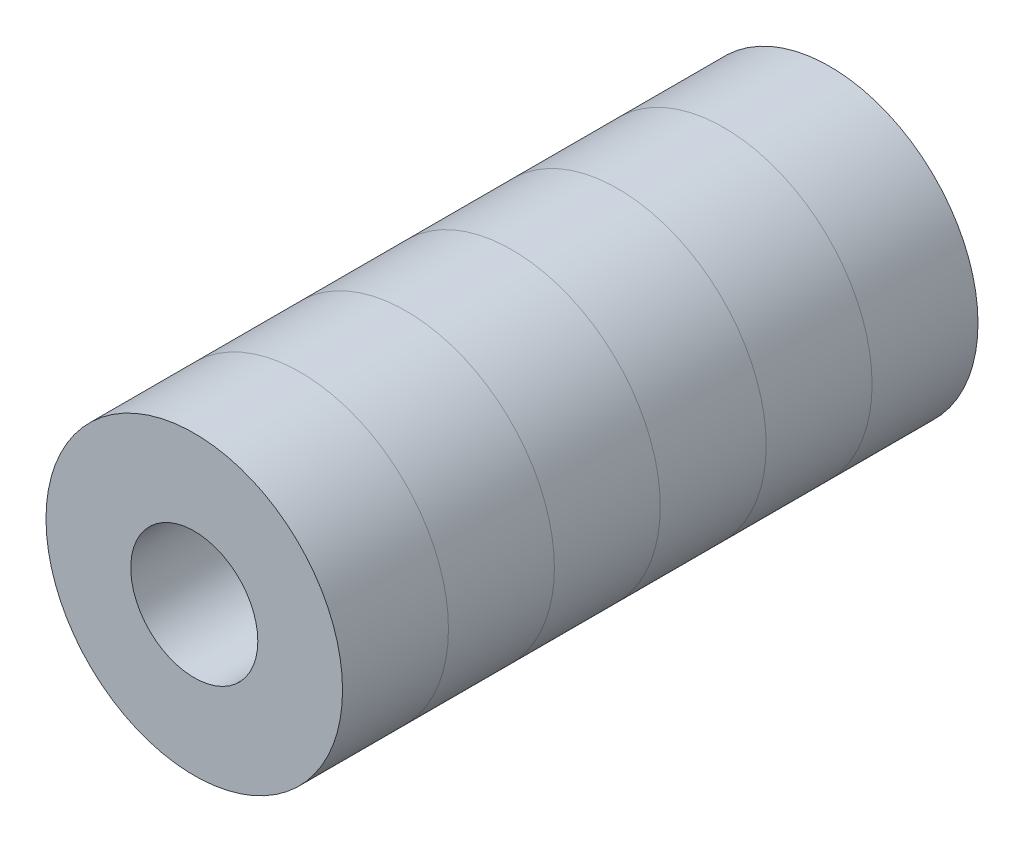
ISO-10303-21;
HEADER;
FILE_DESCRIPTION(('STEP AP214'),'2;1');
FILE_NAME('part.step','',(''),(''),'','','');
FILE_SCHEMA(('AUTOMOTIVE_DESIGN { 1 0 10303 214 1 1 1 1 }'));
ENDSEC;
DATA;
#1=APPLICATION_CONTEXT('core data for automotive mechanical design processes');
#2=APPLICATION_PROTOCOL_DEFINITION('international standard','automotive_design',2000,#1);
#3=PRODUCT_CONTEXT('',#1,'mechanical');
#4=PRODUCT('Part','Part','',(#3));
#5=PRODUCT_RELATED_PRODUCT_CATEGORY('part','',(#4));
#6=PRODUCT_DEFINITION_FORMATION('','',#4);
#7=PRODUCT_DEFINITION_CONTEXT('part definition',#1,'design');
#8=PRODUCT_DEFINITION('design','',#6,#7);
#9=PRODUCT_DEFINITION_SHAPE('','',#8);
#10=(LENGTH_UNIT() NAMED_UNIT(*) SI_UNIT(.MILLI.,.METRE.));
#11=(NAMED_UNIT(*) PLANE_ANGLE_UNIT() SI_UNIT($,.RADIAN.));
#12=(NAMED_UNIT(*) SI_UNIT($,.STERADIAN.) SOLID_ANGLE_UNIT());
#13=UNCERTAINTY_MEASURE_WITH_UNIT(LENGTH_MEASURE(1.E-05),#10,'distance_accuracy_value','');
#14=(GEOMETRIC_REPRESENTATION_CONTEXT(3) GLOBAL_UNCERTAINTY_ASSIGNED_CONTEXT((#13)) GLOBAL_UNIT_ASSIGNED_CONTEXT((#10,
#11,#12)) REPRESENTATION_CONTEXT('',''));
#15=CARTESIAN_POINT('',(0.,0.,0.));
#16=DIRECTION('',(0.,0.,1.));
#17=DIRECTION('',(1.,0.,0.));
#18=AXIS2_PLACEMENT_3D('',#15,#16,#17);
#19=CARTESIAN_POINT('',(0.,0.,-10.));
#20=DIRECTION('',(0.,0.,1.));
#21=DIRECTION('',(1.,0.,0.));
#22=AXIS2_PLACEMENT_3D('',#19,#20,#21);
#23=PLANE('',#22);
#24=CARTESIAN_POINT('',(0.,0.,-10.));
#25=DIRECTION('',(0.,0.,1.));
#26=DIRECTION('',(1.,0.,0.));
#27=AXIS2_PLACEMENT_3D('',#24,#25,#26);
#28=CIRCLE('',#27,3.5);
#29=CARTESIAN_POINT('',(3.5,0.,-10.));
#30=VERTEX_POINT('',#29);
#31=EDGE_CURVE('E11',#30,#30,#28,.T.);
#32=ORIENTED_EDGE('',*,*,#31,.T.);
#33=EDGE_LOOP('',(#32));
#34=FACE_BOUND('',#33,.T.);
#35=CARTESIAN_POINT('',(0.,0.,-10.));
#36=DIRECTION('',(0.,0.,1.));
#37=DIRECTION('',(1.,0.,0.));
#38=AXIS2_PLACEMENT_3D('',#35,#36,#37);
#39=CIRCLE('',#38,1.5);
#40=CARTESIAN_POINT('',(1.5,0.,-10.));
#41=VERTEX_POINT('',#40);
#42=EDGE_CURVE('E61',#41,#41,#39,.T.);
#43=ORIENTED_EDGE('',*,*,#42,.F.);
#44=EDGE_LOOP('',(#43));
#45=FACE_BOUND('',#44,.T.);
#46=ADVANCED_FACE('F50',(#34,#45),#23,.T.);
#47=CARTESIAN_POINT('',(0.,0.,-12.5));
#48=DIRECTION('',(0.,0.,1.));
#49=DIRECTION('',(1.,0.,0.));
#50=AXIS2_PLACEMENT_3D('',#47,#48,#49);
#51=PLANE('',#50);
#52=CARTESIAN_POINT('',(0.,0.,-12.5));
#53=DIRECTION('',(0.,0.,1.));
#54=DIRECTION('',(1.,0.,0.));
#55=AXIS2_PLACEMENT_3D('',#52,#53,#54);
#56=CIRCLE('',#55,3.5);
#57=CARTESIAN_POINT('',(3.5,0.,-12.5));
#58=VERTEX_POINT('',#57);
#59=EDGE_CURVE('E54',#58,#58,#56,.T.);
#60=ORIENTED_EDGE('',*,*,#59,.F.);
#61=EDGE_LOOP('',(#60));
#62=FACE_BOUND('',#61,.T.);
#63=CARTESIAN_POINT('',(0.,0.,-12.5));
#64=DIRECTION('',(0.,0.,1.));
#65=DIRECTION('',(1.,0.,0.));
#66=AXIS2_PLACEMENT_3D('',#63,#64,#65);
#67=CIRCLE('',#66,1.5);
#68=CARTESIAN_POINT('',(1.5,0.,-12.5));
#69=VERTEX_POINT('',#68);
#70=EDGE_CURVE('E63',#69,#69,#67,.T.);
#71=ORIENTED_EDGE('',*,*,#70,.T.);
#72=EDGE_LOOP('',(#71));
#73=FACE_BOUND('',#72,.T.);
#74=ADVANCED_FACE('F73',(#62,#73),#51,.F.);
#75=CARTESIAN_POINT('',(0.,0.,-10.));
#76=DIRECTION('',(0.,0.,-1.));
#77=DIRECTION('',(-1.,0.,0.));
#78=AXIS2_PLACEMENT_3D('',#75,#76,#77);
#79=CYLINDRICAL_SURFACE('',#78,3.5);
#80=ORIENTED_EDGE('',*,*,#31,.F.);
#81=EDGE_LOOP('',(#80));
#82=FACE_BOUND('',#81,.T.);
#83=ORIENTED_EDGE('',*,*,#59,.T.);
#84=EDGE_LOOP('',(#83));
#85=FACE_BOUND('',#84,.T.);
#86=ADVANCED_FACE('F52',(#82,#85),#79,.T.);
#87=CARTESIAN_POINT('',(0.,0.,-10.));
#88=DIRECTION('',(0.,0.,-1.));
#89=DIRECTION('',(-1.,0.,0.));
#90=AXIS2_PLACEMENT_3D('',#87,#88,#89);
#91=CYLINDRICAL_SURFACE('',#90,1.5);
#92=ORIENTED_EDGE('',*,*,#42,.T.);
#93=EDGE_LOOP('',(#92));
#94=FACE_BOUND('',#93,.T.);
#95=ORIENTED_EDGE('',*,*,#70,.F.);
#96=EDGE_LOOP('',(#95));
#97=FACE_BOUND('',#96,.T.);
#98=ADVANCED_FACE('F69',(#94,#97),#91,.F.);
#99=CLOSED_SHELL('',(#46,#74,#86,#98));
#100=MANIFOLD_SOLID_BREP('B2',#99);
#101=CARTESIAN_POINT('',(0.,0.,-7.5));
#102=DIRECTION('',(0.,0.,1.));
#103=DIRECTION('',(1.,0.,0.));
#104=AXIS2_PLACEMENT_3D('',#101,#102,#103);
#105=PLANE('',#104);
#106=CARTESIAN_POINT('',(0.,0.,-7.5));
#107=DIRECTION('',(0.,0.,1.));
#108=DIRECTION('',(1.,0.,0.));
#109=AXIS2_PLACEMENT_3D('',#106,#107,#108);
#110=CIRCLE('',#109,3.5);
#111=CARTESIAN_POINT('',(3.5,0.,-7.5));
#112=VERTEX_POINT('',#111);
#113=EDGE_CURVE('E49',#112,#112,#110,.T.);
#114=ORIENTED_EDGE('',*,*,#113,.T.);
#115=EDGE_LOOP('',(#114));
#116=FACE_BOUND('',#115,.T.);
#117=CARTESIAN_POINT('',(0.,0.,-7.5));
#118=DIRECTION('',(0.,0.,1.));
#119=DIRECTION('',(1.,0.,0.));
#120=AXIS2_PLACEMENT_3D('',#117,#118,#119);
#121=CIRCLE('',#120,1.5);
#122=CARTESIAN_POINT('',(1.5,0.,-7.5));
#123=VERTEX_POINT('',#122);
#124=EDGE_CURVE('E139',#123,#123,#121,.T.);
#125=ORIENTED_EDGE('',*,*,#124,.F.);
#126=EDGE_LOOP('',(#125));
#127=FACE_BOUND('',#126,.T.);
#128=ADVANCED_FACE('F128',(#116,#127),#105,.T.);
#129=CARTESIAN_POINT('',(0.,0.,-10.));
#130=DIRECTION('',(0.,0.,1.));
#131=DIRECTION('',(1.,0.,0.));
#132=AXIS2_PLACEMENT_3D('',#129,#130,#131);
#133=PLANE('',#132);
#134=CARTESIAN_POINT('',(0.,0.,-10.));
#135=DIRECTION('',(0.,0.,1.));
#136=DIRECTION('',(1.,0.,0.));
#137=AXIS2_PLACEMENT_3D('',#134,#135,#136);
#138=CIRCLE('',#137,3.5);
#139=CARTESIAN_POINT('',(3.5,0.,-10.));
#140=VERTEX_POINT('',#139);
#141=EDGE_CURVE('E132',#140,#140,#138,.T.);
#142=ORIENTED_EDGE('',*,*,#141,.F.);
#143=EDGE_LOOP('',(#142));
#144=FACE_BOUND('',#143,.T.);
#145=CARTESIAN_POINT('',(0.,0.,-10.));
#146=DIRECTION('',(0.,0.,1.));
#147=DIRECTION('',(1.,0.,0.));
#148=AXIS2_PLACEMENT_3D('',#145,#146,#147);
#149=CIRCLE('',#148,1.5);
#150=CARTESIAN_POINT('',(1.5,0.,-10.));
#151=VERTEX_POINT('',#150);
#152=EDGE_CURVE('E141',#151,#151,#149,.T.);
#153=ORIENTED_EDGE('',*,*,#152,.T.);
#154=EDGE_LOOP('',(#153));
#155=FACE_BOUND('',#154,.T.);
#156=ADVANCED_FACE('F151',(#144,#155),#133,.F.);
#157=CARTESIAN_POINT('',(0.,0.,-7.5));
#158=DIRECTION('',(0.,0.,-1.));
#159=DIRECTION('',(-1.,0.,0.));
#160=AXIS2_PLACEMENT_3D('',#157,#158,#159);
#161=CYLINDRICAL_SURFACE('',#160,3.5);
#162=ORIENTED_EDGE('',*,*,#113,.F.);
#163=EDGE_LOOP('',(#162));
#164=FACE_BOUND('',#163,.T.);
#165=ORIENTED_EDGE('',*,*,#141,.T.);
#166=EDGE_LOOP('',(#165));
#167=FACE_BOUND('',#166,.T.);
#168=ADVANCED_FACE('F130',(#164,#167),#161,.T.);
#169=CARTESIAN_POINT('',(0.,0.,-7.5));
#170=DIRECTION('',(0.,0.,-1.));
#171=DIRECTION('',(-1.,0.,0.));
#172=AXIS2_PLACEMENT_3D('',#169,#170,#171);
#173=CYLINDRICAL_SURFACE('',#172,1.5);
#174=ORIENTED_EDGE('',*,*,#124,.T.);
#175=EDGE_LOOP('',(#174));
#176=FACE_BOUND('',#175,.T.);
#177=ORIENTED_EDGE('',*,*,#152,.F.);
#178=EDGE_LOOP('',(#177));
#179=FACE_BOUND('',#178,.T.);
#180=ADVANCED_FACE('F147',(#176,#179),#173,.F.);
#181=CLOSED_SHELL('',(#128,#156,#168,#180));
#182=MANIFOLD_SOLID_BREP('B6',#181);
#183=CARTESIAN_POINT('',(0.,0.,-5.));
#184=DIRECTION('',(0.,0.,1.));
#185=DIRECTION('',(1.,0.,0.));
#186=AXIS2_PLACEMENT_3D('',#183,#184,#185);
#187=PLANE('',#186);
#188=CARTESIAN_POINT('',(0.,0.,-5.));
#189=DIRECTION('',(0.,0.,1.));
#190=DIRECTION('',(1.,0.,0.));
#191=AXIS2_PLACEMENT_3D('',#188,#189,#190);
#192=CIRCLE('',#191,3.5);
#193=CARTESIAN_POINT('',(3.5,0.,-5.));
#194=VERTEX_POINT('',#193);
#195=EDGE_CURVE('E127',#194,#194,#192,.T.);
#196=ORIENTED_EDGE('',*,*,#195,.T.);
#197=EDGE_LOOP('',(#196));
#198=FACE_BOUND('',#197,.T.);
#199=CARTESIAN_POINT('',(0.,0.,-5.));
#200=DIRECTION('',(0.,0.,1.));
#201=DIRECTION('',(1.,0.,0.));
#202=AXIS2_PLACEMENT_3D('',#199,#200,#201);
#203=CIRCLE('',#202,1.5);
#204=CARTESIAN_POINT('',(1.5,0.,-5.));
#205=VERTEX_POINT('',#204);
#206=EDGE_CURVE('E219',#205,#205,#203,.T.);
#207=ORIENTED_EDGE('',*,*,#206,.F.);
#208=EDGE_LOOP('',(#207));
#209=FACE_BOUND('',#208,.T.);
#210=ADVANCED_FACE('F206',(#198,#209),#187,.T.);
#211=CARTESIAN_POINT('',(0.,0.,-7.5));
#212=DIRECTION('',(0.,0.,1.));
#213=DIRECTION('',(1.,0.,0.));
#214=AXIS2_PLACEMENT_3D('',#211,#212,#213);
#215=PLANE('',#214);
#216=CARTESIAN_POINT('',(0.,0.,-7.5));
#217=DIRECTION('',(0.,0.,1.));
#218=DIRECTION('',(1.,0.,0.));
#219=AXIS2_PLACEMENT_3D('',#216,#217,#218);
#220=CIRCLE('',#219,3.5);
#221=CARTESIAN_POINT('',(3.5,0.,-7.5));
#222=VERTEX_POINT('',#221);
#223=EDGE_CURVE('E210',#222,#222,#220,.T.);
#224=ORIENTED_EDGE('',*,*,#223,.F.);
#225=EDGE_LOOP('',(#224));
#226=FACE_BOUND('',#225,.T.);
#227=CARTESIAN_POINT('',(0.,0.,-7.5));
#228=DIRECTION('',(0.,0.,1.));
#229=DIRECTION('',(1.,0.,0.));
#230=AXIS2_PLACEMENT_3D('',#227,#228,#229);
#231=CIRCLE('',#230,1.5);
#232=CARTESIAN_POINT('',(1.5,0.,-7.5));
#233=VERTEX_POINT('',#232);
#234=EDGE_CURVE('E221',#233,#233,#231,.T.);
#235=ORIENTED_EDGE('',*,*,#234,.T.);
#236=EDGE_LOOP('',(#235));
#237=FACE_BOUND('',#236,.T.);
#238=ADVANCED_FACE('F233',(#226,#237),#215,.F.);
#239=CARTESIAN_POINT('',(0.,0.,-5.));
#240=DIRECTION('',(0.,0.,-1.));
#241=DIRECTION('',(-1.,0.,0.));
#242=AXIS2_PLACEMENT_3D('',#239,#240,#241);
#243=CYLINDRICAL_SURFACE('',#242,3.5);
#244=ORIENTED_EDGE('',*,*,#195,.F.);
#245=EDGE_LOOP('',(#244));
#246=FACE_BOUND('',#245,.T.);
#247=ORIENTED_EDGE('',*,*,#223,.T.);
#248=EDGE_LOOP('',(#247));
#249=FACE_BOUND('',#248,.T.);
#250=ADVANCED_FACE('F208',(#246,#249),#243,.T.);
#251=CARTESIAN_POINT('',(0.,0.,-5.));
#252=DIRECTION('',(0.,0.,-1.));
#253=DIRECTION('',(-1.,0.,0.));
#254=AXIS2_PLACEMENT_3D('',#251,#252,#253);
#255=CYLINDRICAL_SURFACE('',#254,1.5);
#256=ORIENTED_EDGE('',*,*,#206,.T.);
#257=EDGE_LOOP('',(#256));
#258=FACE_BOUND('',#257,.T.);
#259=ORIENTED_EDGE('',*,*,#234,.F.);
#260=EDGE_LOOP('',(#259));
#261=FACE_BOUND('',#260,.T.);
#262=ADVANCED_FACE('F229',(#258,#261),#255,.F.);
#263=CLOSED_SHELL('',(#210,#238,#250,#262));
#264=MANIFOLD_SOLID_BREP('B44',#263);
#265=CARTESIAN_POINT('',(0.,0.,-2.5));
#266=DIRECTION('',(0.,0.,1.));
#267=DIRECTION('',(1.,0.,0.));
#268=AXIS2_PLACEMENT_3D('',#265,#266,#267);
#269=PLANE('',#268);
#270=CARTESIAN_POINT('',(0.,0.,-2.5));
#271=DIRECTION('',(0.,0.,1.));
#272=DIRECTION('',(1.,0.,0.));
#273=AXIS2_PLACEMENT_3D('',#270,#271,#272);
#274=CIRCLE('',#273,3.5);
#275=CARTESIAN_POINT('',(3.5,0.,-2.5));
#276=VERTEX_POINT('',#275);
#277=EDGE_CURVE('E205',#276,#276,#274,.T.);
#278=ORIENTED_EDGE('',*,*,#277,.T.);
#279=EDGE_LOOP('',(#278));
#280=FACE_BOUND('',#279,.T.);
#281=CARTESIAN_POINT('',(0.,0.,-2.5));
#282=DIRECTION('',(0.,0.,1.));
#283=DIRECTION('',(1.,0.,0.));
#284=AXIS2_PLACEMENT_3D('',#281,#282,#283);
#285=CIRCLE('',#284,1.5);
#286=CARTESIAN_POINT('',(1.5,0.,-2.5));
#287=VERTEX_POINT('',#286);
#288=EDGE_CURVE('E299',#287,#287,#285,.T.);
#289=ORIENTED_EDGE('',*,*,#288,.F.);
#290=EDGE_LOOP('',(#289));
#291=FACE_BOUND('',#290,.T.);
#292=ADVANCED_FACE('F288',(#280,#291),#269,.T.);
#293=CARTESIAN_POINT('',(0.,0.,-5.));
#294=DIRECTION('',(0.,0.,1.));
#295=DIRECTION('',(1.,0.,0.));
#296=AXIS2_PLACEMENT_3D('',#293,#294,#295);
#297=PLANE('',#296);
#298=CARTESIAN_POINT('',(0.,0.,-5.));
#299=DIRECTION('',(0.,0.,1.));
#300=DIRECTION('',(1.,0.,0.));
#301=AXIS2_PLACEMENT_3D('',#298,#299,#300);
#302=CIRCLE('',#301,3.5);
#303=CARTESIAN_POINT('',(3.5,0.,-5.));
#304=VERTEX_POINT('',#303);
#305=EDGE_CURVE('E292',#304,#304,#302,.T.);
#306=ORIENTED_EDGE('',*,*,#305,.F.);
#307=EDGE_LOOP('',(#306));
#308=FACE_BOUND('',#307,.T.);
#309=CARTESIAN_POINT('',(0.,0.,-5.));
#310=DIRECTION('',(0.,0.,1.));
#311=DIRECTION('',(1.,0.,0.));
#312=AXIS2_PLACEMENT_3D('',#309,#310,#311);
#313=CIRCLE('',#312,1.5);
#314=CARTESIAN_POINT('',(1.5,0.,-5.));
#315=VERTEX_POINT('',#314);
#316=EDGE_CURVE('E301',#315,#315,#313,.T.);
#317=ORIENTED_EDGE('',*,*,#316,.T.);
#318=EDGE_LOOP('',(#317));
#319=FACE_BOUND('',#318,.T.);
#320=ADVANCED_FACE('F311',(#308,#319),#297,.F.);
#321=CARTESIAN_POINT('',(0.,0.,-2.5));
#322=DIRECTION('',(0.,0.,-1.));
#323=DIRECTION('',(-1.,0.,0.));
#324=AXIS2_PLACEMENT_3D('',#321,#322,#323);
#325=CYLINDRICAL_SURFACE('',#324,3.5);
#326=ORIENTED_EDGE('',*,*,#277,.F.);
#327=EDGE_LOOP('',(#326));
#328=FACE_BOUND('',#327,.T.);
#329=ORIENTED_EDGE('',*,*,#305,.T.);
#330=EDGE_LOOP('',(#329));
#331=FACE_BOUND('',#330,.T.);
#332=ADVANCED_FACE('F290',(#328,#331),#325,.T.);
#333=CARTESIAN_POINT('',(0.,0.,-2.5));
#334=DIRECTION('',(0.,0.,-1.));
#335=DIRECTION('',(-1.,0.,0.));
#336=AXIS2_PLACEMENT_3D('',#333,#334,#335);
#337=CYLINDRICAL_SURFACE('',#336,1.5);
#338=ORIENTED_EDGE('',*,*,#288,.T.);
#339=EDGE_LOOP('',(#338));
#340=FACE_BOUND('',#339,.T.);
#341=ORIENTED_EDGE('',*,*,#316,.F.);
#342=EDGE_LOOP('',(#341));
#343=FACE_BOUND('',#342,.T.);
#344=ADVANCED_FACE('F307',(#340,#343),#337,.F.);
#345=CLOSED_SHELL('',(#292,#320,#332,#344));
#346=MANIFOLD_SOLID_BREP('B122',#345);
#347=CARTESIAN_POINT('',(0.,0.,0.));
#348=DIRECTION('',(0.,0.,1.));
#349=DIRECTION('',(1.,0.,0.));
#350=AXIS2_PLACEMENT_3D('',#347,#348,#349);
#351=PLANE('',#350);
#352=CARTESIAN_POINT('',(0.,0.,0.));
#353=DIRECTION('',(0.,0.,1.));
#354=DIRECTION('',(1.,0.,0.));
#355=AXIS2_PLACEMENT_3D('',#352,#353,#354);
#356=CIRCLE('',#355,3.5);
#357=CARTESIAN_POINT('',(3.5,0.,0.));
#358=VERTEX_POINT('',#357);
#359=EDGE_CURVE('E287',#358,#358,#356,.T.);
#360=ORIENTED_EDGE('',*,*,#359,.T.);
#361=EDGE_LOOP('',(#360));
#362=FACE_BOUND('',#361,.T.);
#363=CARTESIAN_POINT('',(0.,0.,0.));
#364=DIRECTION('',(0.,0.,1.));
#365=DIRECTION('',(1.,0.,0.));
#366=AXIS2_PLACEMENT_3D('',#363,#364,#365);
#367=CIRCLE('',#366,1.5);
#368=CARTESIAN_POINT('',(1.5,0.,0.));
#369=VERTEX_POINT('',#368);
#370=EDGE_CURVE('E376',#369,#369,#367,.T.);
#371=ORIENTED_EDGE('',*,*,#370,.F.);
#372=EDGE_LOOP('',(#371));
#373=FACE_BOUND('',#372,.T.);
#374=ADVANCED_FACE('F365',(#362,#373),#351,.T.);
#375=CARTESIAN_POINT('',(0.,0.,-2.5));
#376=DIRECTION('',(0.,0.,1.));
#377=DIRECTION('',(1.,0.,0.));
#378=AXIS2_PLACEMENT_3D('',#375,#376,#377);
#379=PLANE('',#378);
#380=CARTESIAN_POINT('',(0.,0.,-2.5));
#381=DIRECTION('',(0.,0.,1.));
#382=DIRECTION('',(1.,0.,0.));
#383=AXIS2_PLACEMENT_3D('',#380,#381,#382);
#384=CIRCLE('',#383,3.5);
#385=CARTESIAN_POINT('',(3.5,0.,-2.5));
#386=VERTEX_POINT('',#385);
#387=EDGE_CURVE('E369',#386,#386,#384,.T.);
#388=ORIENTED_EDGE('',*,*,#387,.F.);
#389=EDGE_LOOP('',(#388));
#390=FACE_BOUND('',#389,.T.);
#391=CARTESIAN_POINT('',(0.,0.,-2.5));
#392=DIRECTION('',(0.,0.,1.));
#393=DIRECTION('',(1.,0.,0.));
#394=AXIS2_PLACEMENT_3D('',#391,#392,#393);
#395=CIRCLE('',#394,1.5);
#396=CARTESIAN_POINT('',(1.5,0.,-2.5));
#397=VERTEX_POINT('',#396);
#398=EDGE_CURVE('E378',#397,#397,#395,.T.);
#399=ORIENTED_EDGE('',*,*,#398,.T.);
#400=EDGE_LOOP('',(#399));
#401=FACE_BOUND('',#400,.T.);
#402=ADVANCED_FACE('F388',(#390,#401),#379,.F.);
#403=CARTESIAN_POINT('',(0.,0.,0.));
#404=DIRECTION('',(0.,0.,-1.));
#405=DIRECTION('',(-1.,0.,0.));
#406=AXIS2_PLACEMENT_3D('',#403,#404,#405);
#407=CYLINDRICAL_SURFACE('',#406,3.5);
#408=ORIENTED_EDGE('',*,*,#359,.F.);
#409=EDGE_LOOP('',(#408));
#410=FACE_BOUND('',#409,.T.);
#411=ORIENTED_EDGE('',*,*,#387,.T.);
#412=EDGE_LOOP('',(#411));
#413=FACE_BOUND('',#412,.T.);
#414=ADVANCED_FACE('F367',(#410,#413),#407,.T.);
#415=CARTESIAN_POINT('',(0.,0.,0.));
#416=DIRECTION('',(0.,0.,-1.));
#417=DIRECTION('',(-1.,0.,0.));
#418=AXIS2_PLACEMENT_3D('',#415,#416,#417);
#419=CYLINDRICAL_SURFACE('',#418,1.5);
#420=ORIENTED_EDGE('',*,*,#370,.T.);
#421=EDGE_LOOP('',(#420));
#422=FACE_BOUND('',#421,.T.);
#423=ORIENTED_EDGE('',*,*,#398,.F.);
#424=EDGE_LOOP('',(#423));
#425=FACE_BOUND('',#424,.T.);
#426=ADVANCED_FACE('F384',(#422,#425),#419,.F.);
#427=CLOSED_SHELL('',(#374,#402,#414,#426));
#428=MANIFOLD_SOLID_BREP('B200',#427);
#429=CARTESIAN_POINT('',(0.,0.,2.5));
#430=DIRECTION('',(0.,0.,1.));
#431=DIRECTION('',(1.,0.,0.));
#432=AXIS2_PLACEMENT_3D('',#429,#430,#431);
#433=PLANE('',#432);
#434=CARTESIAN_POINT('',(0.,0.,2.5));
#435=DIRECTION('',(0.,0.,1.));
#436=DIRECTION('',(1.,0.,0.));
#437=AXIS2_PLACEMENT_3D('',#434,#435,#436);
#438=CIRCLE('',#437,3.5);
#439=CARTESIAN_POINT('',(3.5,0.,2.5));
#440=VERTEX_POINT('',#439);
#441=EDGE_CURVE('E364',#440,#440,#438,.T.);
#442=ORIENTED_EDGE('',*,*,#441,.T.);
#443=EDGE_LOOP('',(#442));
#444=FACE_BOUND('',#443,.T.);
#445=CARTESIAN_POINT('',(0.,0.,2.5));
#446=DIRECTION('',(0.,0.,1.));
#447=DIRECTION('',(1.,0.,0.));
#448=AXIS2_PLACEMENT_3D('',#445,#446,#447);
#449=CIRCLE('',#448,1.5);
#450=CARTESIAN_POINT('',(1.5,0.,2.5));
#451=VERTEX_POINT('',#450);
#452=EDGE_CURVE('E446',#451,#451,#449,.T.);
#453=ORIENTED_EDGE('',*,*,#452,.F.);
#454=EDGE_LOOP('',(#453));
#455=FACE_BOUND('',#454,.T.);
#456=ADVANCED_FACE('F435',(#444,#455),#433,.T.);
#457=CARTESIAN_POINT('',(0.,0.,0.));
#458=DIRECTION('',(0.,0.,1.));
#459=DIRECTION('',(1.,0.,0.));
#460=AXIS2_PLACEMENT_3D('',#457,#458,#459);
#461=PLANE('',#460);
#462=CARTESIAN_POINT('',(0.,0.,0.));
#463=DIRECTION('',(0.,0.,1.));
#464=DIRECTION('',(1.,0.,0.));
#465=AXIS2_PLACEMENT_3D('',#462,#463,#464);
#466=CIRCLE('',#465,3.5);
#467=CARTESIAN_POINT('',(3.5,0.,0.));
#468=VERTEX_POINT('',#467);
#469=EDGE_CURVE('E439',#468,#468,#466,.T.);
#470=ORIENTED_EDGE('',*,*,#469,.F.);
#471=EDGE_LOOP('',(#470));
#472=FACE_BOUND('',#471,.T.);
#473=CARTESIAN_POINT('',(0.,0.,0.));
#474=DIRECTION('',(0.,0.,1.));
#475=DIRECTION('',(1.,0.,0.));
#476=AXIS2_PLACEMENT_3D('',#473,#474,#475);
#477=CIRCLE('',#476,1.5);
#478=CARTESIAN_POINT('',(1.5,0.,0.));
#479=VERTEX_POINT('',#478);
#480=EDGE_CURVE('E448',#479,#479,#477,.T.);
#481=ORIENTED_EDGE('',*,*,#480,.T.);
#482=EDGE_LOOP('',(#481));
#483=FACE_BOUND('',#482,.T.);
#484=ADVANCED_FACE('F458',(#472,#483),#461,.F.);
#485=CARTESIAN_POINT('',(0.,0.,2.5));
#486=DIRECTION('',(0.,0.,-1.));
#487=DIRECTION('',(-1.,0.,0.));
#488=AXIS2_PLACEMENT_3D('',#485,#486,#487);
#489=CYLINDRICAL_SURFACE('',#488,3.5);
#490=ORIENTED_EDGE('',*,*,#441,.F.);
#491=EDGE_LOOP('',(#490));
#492=FACE_BOUND('',#491,.T.);
#493=ORIENTED_EDGE('',*,*,#469,.T.);
#494=EDGE_LOOP('',(#493));
#495=FACE_BOUND('',#494,.T.);
#496=ADVANCED_FACE('F437',(#492,#495),#489,.T.);
#497=CARTESIAN_POINT('',(0.,0.,2.5));
#498=DIRECTION('',(0.,0.,-1.));
#499=DIRECTION('',(-1.,0.,0.));
#500=AXIS2_PLACEMENT_3D('',#497,#498,#499);
#501=CYLINDRICAL_SURFACE('',#500,1.5);
#502=ORIENTED_EDGE('',*,*,#452,.T.);
#503=EDGE_LOOP('',(#502));
#504=FACE_BOUND('',#503,.T.);
#505=ORIENTED_EDGE('',*,*,#480,.F.);
#506=EDGE_LOOP('',(#505));
#507=FACE_BOUND('',#506,.T.);
#508=ADVANCED_FACE('F454',(#504,#507),#501,.F.);
#509=CLOSED_SHELL('',(#456,#484,#496,#508));
#510=MANIFOLD_SOLID_BREP('B282',#509);
#511=ADVANCED_BREP_SHAPE_REPRESENTATION('',(#18,#100,#182,#264,#346,#428,#510),#14);
#512=SHAPE_DEFINITION_REPRESENTATION(#9,#511);
ENDSEC;
END-ISO-10303-21;
